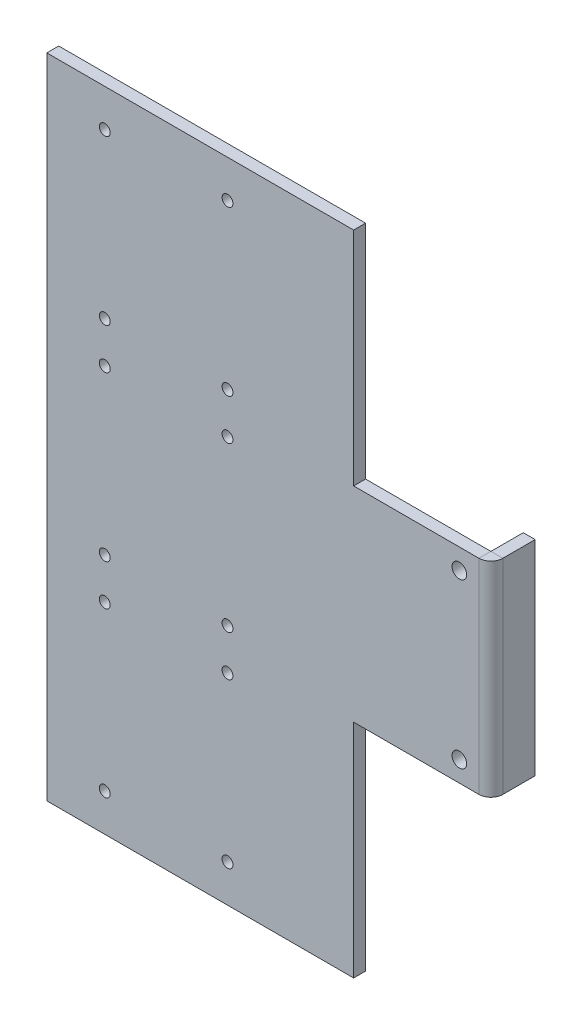
ISO-10303-21;
HEADER;
FILE_DESCRIPTION(('STEP AP214'),'2;1');
FILE_NAME('part.step','',(''),(''),'','','');
FILE_SCHEMA(('AUTOMOTIVE_DESIGN { 1 0 10303 214 1 1 1 1 }'));
ENDSEC;
DATA;
#1=APPLICATION_CONTEXT('core data for automotive mechanical design processes');
#2=APPLICATION_PROTOCOL_DEFINITION('international standard','automotive_design',2000,#1);
#3=PRODUCT_CONTEXT('',#1,'mechanical');
#4=PRODUCT('Part','Part','',(#3));
#5=PRODUCT_RELATED_PRODUCT_CATEGORY('part','',(#4));
#6=PRODUCT_DEFINITION_FORMATION('','',#4);
#7=PRODUCT_DEFINITION_CONTEXT('part definition',#1,'design');
#8=PRODUCT_DEFINITION('design','',#6,#7);
#9=PRODUCT_DEFINITION_SHAPE('','',#8);
#10=(LENGTH_UNIT() NAMED_UNIT(*) SI_UNIT(.MILLI.,.METRE.));
#11=(NAMED_UNIT(*) PLANE_ANGLE_UNIT() SI_UNIT($,.RADIAN.));
#12=(NAMED_UNIT(*) SI_UNIT($,.STERADIAN.) SOLID_ANGLE_UNIT());
#13=UNCERTAINTY_MEASURE_WITH_UNIT(LENGTH_MEASURE(1.E-05),#10,'distance_accuracy_value','');
#14=(GEOMETRIC_REPRESENTATION_CONTEXT(3) GLOBAL_UNCERTAINTY_ASSIGNED_CONTEXT((#13)) GLOBAL_UNIT_ASSIGNED_CONTEXT((#10,
#11,#12)) REPRESENTATION_CONTEXT('',''));
#15=CARTESIAN_POINT('',(0.,0.,0.));
#16=DIRECTION('',(0.,0.,1.));
#17=DIRECTION('',(1.,0.,0.));
#18=AXIS2_PLACEMENT_3D('',#15,#16,#17);
#19=CARTESIAN_POINT('',(81.7555532140548,0.,81.0044467859456));
#20=DIRECTION('',(1.,0.,0.));
#21=DIRECTION('',(0.,0.,-1.));
#22=AXIS2_PLACEMENT_3D('',#19,#20,#21);
#23=PLANE('',#22);
#24=DIRECTION('',(0.,0.,-1.));
#25=VECTOR('',#24,1.);
#26=CARTESIAN_POINT('',(81.7555532140545,-30.,-12.9955532140545));
#27=LINE('',#26,#25);
#28=CARTESIAN_POINT('',(81.7555532140545,-30.,-3.5));
#29=VERTEX_POINT('',#28);
#30=CARTESIAN_POINT('',(81.7555532140545,-30.,-12.9955532140545));
#31=VERTEX_POINT('',#30);
#32=EDGE_CURVE('E66',#29,#31,#27,.T.);
#33=ORIENTED_EDGE('',*,*,#32,.F.);
#34=DIRECTION('',(0.,1.,0.));
#35=VECTOR('',#34,1.);
#36=CARTESIAN_POINT('',(81.7555532140546,0.,-3.5));
#37=LINE('',#36,#35);
#38=CARTESIAN_POINT('',(81.7555532140545,30.,-3.5));
#39=VERTEX_POINT('',#38);
#40=EDGE_CURVE('E144',#29,#39,#37,.T.);
#41=ORIENTED_EDGE('',*,*,#40,.T.);
#42=DIRECTION('',(0.,0.,1.));
#43=VECTOR('',#42,1.);
#44=CARTESIAN_POINT('',(81.7555532140545,30.,-12.9955532140545));
#45=LINE('',#44,#43);
#46=CARTESIAN_POINT('',(81.7555532140545,30.,-12.9955532140545));
#47=VERTEX_POINT('',#46);
#48=EDGE_CURVE('E74',#47,#39,#45,.T.);
#49=ORIENTED_EDGE('',*,*,#48,.F.);
#50=DIRECTION('',(0.,1.,0.));
#51=VECTOR('',#50,1.);
#52=CARTESIAN_POINT('',(81.7555532140545,30.,-12.9955532140545));
#53=LINE('',#52,#51);
#54=EDGE_CURVE('E251',#31,#47,#53,.T.);
#55=ORIENTED_EDGE('',*,*,#54,.F.);
#56=EDGE_LOOP('',(#33,#41,#49,#55));
#57=FACE_BOUND('',#56,.T.);
#58=ADVANCED_FACE('F48',(#57),#23,.F.);
#59=CARTESIAN_POINT('',(81.7555532140545,30.,-12.9955532140545));
#60=DIRECTION('',(0.,1.,0.));
#61=DIRECTION('',(0.,0.,1.));
#62=AXIS2_PLACEMENT_3D('',#59,#60,#61);
#63=PLANE('',#62);
#64=DIRECTION('',(-1.,0.,0.));
#65=VECTOR('',#64,1.);
#66=CARTESIAN_POINT('',(81.7555532140545,30.,-3.5));
#67=LINE('',#66,#65);
#68=CARTESIAN_POINT('',(85.2555532140545,30.,-3.50000000000002));
#69=VERTEX_POINT('',#68);
#70=EDGE_CURVE('E58',#69,#39,#67,.T.);
#71=ORIENTED_EDGE('',*,*,#70,.F.);
#72=DIRECTION('',(0.,0.,1.));
#73=VECTOR('',#72,1.);
#74=CARTESIAN_POINT('',(85.2555532140545,30.,-12.9955532140545));
#75=LINE('',#74,#73);
#76=CARTESIAN_POINT('',(85.2555532140545,30.,-12.9955532140545));
#77=VERTEX_POINT('',#76);
#78=EDGE_CURVE('E258',#77,#69,#75,.T.);
#79=ORIENTED_EDGE('',*,*,#78,.F.);
#80=DIRECTION('',(1.,0.,0.));
#81=VECTOR('',#80,1.);
#82=CARTESIAN_POINT('',(81.7555532140545,30.,-12.9955532140545));
#83=LINE('',#82,#81);
#84=EDGE_CURVE('E259',#47,#77,#83,.T.);
#85=ORIENTED_EDGE('',*,*,#84,.F.);
#86=ORIENTED_EDGE('',*,*,#48,.T.);
#87=EDGE_LOOP('',(#71,#79,#85,#86));
#88=FACE_BOUND('',#87,.T.);
#89=ADVANCED_FACE('F567',(#88),#63,.T.);
#90=CARTESIAN_POINT('',(81.7555532140545,30.,-12.9955532140545));
#91=DIRECTION('',(0.,0.,-1.));
#92=DIRECTION('',(0.,1.,0.));
#93=AXIS2_PLACEMENT_3D('',#90,#91,#92);
#94=PLANE('',#93);
#95=DIRECTION('',(0.,1.,0.));
#96=VECTOR('',#95,1.);
#97=CARTESIAN_POINT('',(85.2555532140545,30.,-12.9955532140545));
#98=LINE('',#97,#96);
#99=CARTESIAN_POINT('',(85.2555532140545,-30.,-12.9955532140545));
#100=VERTEX_POINT('',#99);
#101=EDGE_CURVE('E180',#100,#77,#98,.T.);
#102=ORIENTED_EDGE('',*,*,#101,.F.);
#103=DIRECTION('',(1.,0.,0.));
#104=VECTOR('',#103,1.);
#105=CARTESIAN_POINT('',(81.7555532140545,-30.,-12.9955532140545));
#106=LINE('',#105,#104);
#107=EDGE_CURVE('E263',#31,#100,#106,.T.);
#108=ORIENTED_EDGE('',*,*,#107,.F.);
#109=ORIENTED_EDGE('',*,*,#54,.T.);
#110=ORIENTED_EDGE('',*,*,#84,.T.);
#111=EDGE_LOOP('',(#102,#108,#109,#110));
#112=FACE_BOUND('',#111,.T.);
#113=ADVANCED_FACE('F574',(#112),#94,.T.);
#114=CARTESIAN_POINT('',(81.7555532140545,-30.,-12.9955532140545));
#115=DIRECTION('',(0.,-1.,0.));
#116=DIRECTION('',(0.,0.,-1.));
#117=AXIS2_PLACEMENT_3D('',#114,#115,#116);
#118=PLANE('',#117);
#119=DIRECTION('',(1.,0.,0.));
#120=VECTOR('',#119,1.);
#121=CARTESIAN_POINT('',(81.7555532140545,-30.,-3.5));
#122=LINE('',#121,#120);
#123=CARTESIAN_POINT('',(85.2555532140546,-30.,-3.50000000000003));
#124=VERTEX_POINT('',#123);
#125=EDGE_CURVE('E12',#29,#124,#122,.T.);
#126=ORIENTED_EDGE('',*,*,#125,.F.);
#127=ORIENTED_EDGE('',*,*,#32,.T.);
#128=ORIENTED_EDGE('',*,*,#107,.T.);
#129=DIRECTION('',(0.,0.,-1.));
#130=VECTOR('',#129,1.);
#131=CARTESIAN_POINT('',(85.2555532140545,-30.,-12.9955532140545));
#132=LINE('',#131,#130);
#133=EDGE_CURVE('E174',#124,#100,#132,.T.);
#134=ORIENTED_EDGE('',*,*,#133,.F.);
#135=EDGE_LOOP('',(#126,#127,#128,#134));
#136=FACE_BOUND('',#135,.T.);
#137=ADVANCED_FACE('F50',(#136),#118,.T.);
#138=CARTESIAN_POINT('',(85.2555532140548,0.,81.0044467859456));
#139=DIRECTION('',(1.,0.,0.));
#140=DIRECTION('',(0.,0.,-1.));
#141=AXIS2_PLACEMENT_3D('',#138,#139,#140);
#142=PLANE('',#141);
#143=DIRECTION('',(0.,1.,0.));
#144=VECTOR('',#143,1.);
#145=CARTESIAN_POINT('',(85.2555532140545,0.,-3.50000000000002));
#146=LINE('',#145,#144);
#147=EDGE_CURVE('E262',#124,#69,#146,.T.);
#148=ORIENTED_EDGE('',*,*,#147,.F.);
#149=ORIENTED_EDGE('',*,*,#133,.T.);
#150=ORIENTED_EDGE('',*,*,#101,.T.);
#151=ORIENTED_EDGE('',*,*,#78,.T.);
#152=EDGE_LOOP('',(#148,#149,#150,#151));
#153=FACE_BOUND('',#152,.T.);
#154=ADVANCED_FACE('F571',(#153),#142,.T.);
#155=CARTESIAN_POINT('',(45.0000000000001,-30.,-3.5));
#156=DIRECTION('',(1.,0.,0.));
#157=DIRECTION('',(0.,1.,0.));
#158=AXIS2_PLACEMENT_3D('',#155,#156,#157);
#159=PLANE('',#158);
#160=DIRECTION('',(0.,1.,0.));
#161=VECTOR('',#160,1.);
#162=CARTESIAN_POINT('',(45.0000000000001,-30.,0.));
#163=LINE('',#162,#161);
#164=CARTESIAN_POINT('',(45.0000000000001,-95.,0.));
#165=VERTEX_POINT('',#164);
#166=CARTESIAN_POINT('',(45.0000000000001,-30.,0.));
#167=VERTEX_POINT('',#166);
#168=EDGE_CURVE('E164',#165,#167,#163,.T.);
#169=ORIENTED_EDGE('',*,*,#168,.F.);
#170=DIRECTION('',(0.,0.,1.));
#171=VECTOR('',#170,1.);
#172=CARTESIAN_POINT('',(45.0000000000001,-95.,-3.5));
#173=LINE('',#172,#171);
#174=CARTESIAN_POINT('',(45.0000000000001,-95.,-3.5));
#175=VERTEX_POINT('',#174);
#176=EDGE_CURVE('E235',#175,#165,#173,.T.);
#177=ORIENTED_EDGE('',*,*,#176,.F.);
#178=DIRECTION('',(0.,1.,0.));
#179=VECTOR('',#178,1.);
#180=CARTESIAN_POINT('',(45.0000000000001,-30.,-3.5));
#181=LINE('',#180,#179);
#182=CARTESIAN_POINT('',(45.0000000000001,-30.,-3.5));
#183=VERTEX_POINT('',#182);
#184=EDGE_CURVE('E245',#175,#183,#181,.T.);
#185=ORIENTED_EDGE('',*,*,#184,.T.);
#186=DIRECTION('',(0.,0.,1.));
#187=VECTOR('',#186,1.);
#188=CARTESIAN_POINT('',(45.0000000000001,-30.,-3.5));
#189=LINE('',#188,#187);
#190=EDGE_CURVE('E242',#183,#167,#189,.T.);
#191=ORIENTED_EDGE('',*,*,#190,.T.);
#192=EDGE_LOOP('',(#169,#177,#185,#191));
#193=FACE_BOUND('',#192,.T.);
#194=ADVANCED_FACE('F581',(#193),#159,.T.);
#195=CARTESIAN_POINT('',(-44.9999999999999,-95.,-3.5));
#196=DIRECTION('',(0.,-1.,0.));
#197=DIRECTION('',(0.,0.,-1.));
#198=AXIS2_PLACEMENT_3D('',#195,#196,#197);
#199=PLANE('',#198);
#200=DIRECTION('',(1.,0.,0.));
#201=VECTOR('',#200,1.);
#202=CARTESIAN_POINT('',(-44.9999999999999,-95.,0.));
#203=LINE('',#202,#201);
#204=CARTESIAN_POINT('',(-44.9999999999999,-95.,0.));
#205=VERTEX_POINT('',#204);
#206=EDGE_CURVE('E198',#205,#165,#203,.T.);
#207=ORIENTED_EDGE('',*,*,#206,.F.);
#208=DIRECTION('',(0.,0.,1.));
#209=VECTOR('',#208,1.);
#210=CARTESIAN_POINT('',(-44.9999999999999,-95.,-3.5));
#211=LINE('',#210,#209);
#212=CARTESIAN_POINT('',(-44.9999999999999,-95.,-3.5));
#213=VERTEX_POINT('',#212);
#214=EDGE_CURVE('E228',#213,#205,#211,.T.);
#215=ORIENTED_EDGE('',*,*,#214,.F.);
#216=DIRECTION('',(1.,0.,0.));
#217=VECTOR('',#216,1.);
#218=CARTESIAN_POINT('',(-44.9999999999999,-95.,-3.5));
#219=LINE('',#218,#217);
#220=EDGE_CURVE('E238',#213,#175,#219,.T.);
#221=ORIENTED_EDGE('',*,*,#220,.T.);
#222=ORIENTED_EDGE('',*,*,#176,.T.);
#223=EDGE_LOOP('',(#207,#215,#221,#222));
#224=FACE_BOUND('',#223,.T.);
#225=ADVANCED_FACE('F605',(#224),#199,.T.);
#226=CARTESIAN_POINT('',(-44.9999999999999,95.,-3.5));
#227=DIRECTION('',(-1.,0.,0.));
#228=DIRECTION('',(0.,-1.,0.));
#229=AXIS2_PLACEMENT_3D('',#226,#227,#228);
#230=PLANE('',#229);
#231=DIRECTION('',(0.,-1.,0.));
#232=VECTOR('',#231,1.);
#233=CARTESIAN_POINT('',(-44.9999999999999,95.,0.));
#234=LINE('',#233,#232);
#235=CARTESIAN_POINT('',(-44.9999999999999,95.,0.));
#236=VERTEX_POINT('',#235);
#237=EDGE_CURVE('E201',#236,#205,#234,.T.);
#238=ORIENTED_EDGE('',*,*,#237,.F.);
#239=DIRECTION('',(0.,0.,1.));
#240=VECTOR('',#239,1.);
#241=CARTESIAN_POINT('',(-44.9999999999999,95.,-3.5));
#242=LINE('',#241,#240);
#243=CARTESIAN_POINT('',(-44.9999999999999,95.,-3.5));
#244=VERTEX_POINT('',#243);
#245=EDGE_CURVE('E221',#244,#236,#242,.T.);
#246=ORIENTED_EDGE('',*,*,#245,.F.);
#247=DIRECTION('',(0.,-1.,0.));
#248=VECTOR('',#247,1.);
#249=CARTESIAN_POINT('',(-44.9999999999999,95.,-3.5));
#250=LINE('',#249,#248);
#251=EDGE_CURVE('E231',#244,#213,#250,.T.);
#252=ORIENTED_EDGE('',*,*,#251,.T.);
#253=ORIENTED_EDGE('',*,*,#214,.T.);
#254=EDGE_LOOP('',(#238,#246,#252,#253));
#255=FACE_BOUND('',#254,.T.);
#256=ADVANCED_FACE('F601',(#255),#230,.T.);
#257=CARTESIAN_POINT('',(-44.9999999999999,95.,-3.5));
#258=DIRECTION('',(0.,1.,0.));
#259=DIRECTION('',(0.,0.,1.));
#260=AXIS2_PLACEMENT_3D('',#257,#258,#259);
#261=PLANE('',#260);
#262=DIRECTION('',(-1.,0.,0.));
#263=VECTOR('',#262,1.);
#264=CARTESIAN_POINT('',(-44.9999999999999,95.,0.));
#265=LINE('',#264,#263);
#266=CARTESIAN_POINT('',(45.0000000000001,95.,0.));
#267=VERTEX_POINT('',#266);
#268=EDGE_CURVE('E205',#267,#236,#265,.T.);
#269=ORIENTED_EDGE('',*,*,#268,.F.);
#270=DIRECTION('',(0.,0.,1.));
#271=VECTOR('',#270,1.);
#272=CARTESIAN_POINT('',(45.0000000000001,95.,-3.5));
#273=LINE('',#272,#271);
#274=CARTESIAN_POINT('',(45.0000000000001,95.,-3.5));
#275=VERTEX_POINT('',#274);
#276=EDGE_CURVE('E167',#275,#267,#273,.T.);
#277=ORIENTED_EDGE('',*,*,#276,.F.);
#278=DIRECTION('',(-1.,0.,0.));
#279=VECTOR('',#278,1.);
#280=CARTESIAN_POINT('',(-44.9999999999999,95.,-3.5));
#281=LINE('',#280,#279);
#282=EDGE_CURVE('E224',#275,#244,#281,.T.);
#283=ORIENTED_EDGE('',*,*,#282,.T.);
#284=ORIENTED_EDGE('',*,*,#245,.T.);
#285=EDGE_LOOP('',(#269,#277,#283,#284));
#286=FACE_BOUND('',#285,.T.);
#287=ADVANCED_FACE('F597',(#286),#261,.T.);
#288=CARTESIAN_POINT('',(45.0000000000001,95.,-3.5));
#289=DIRECTION('',(1.,0.,0.));
#290=DIRECTION('',(0.,1.,0.));
#291=AXIS2_PLACEMENT_3D('',#288,#289,#290);
#292=PLANE('',#291);
#293=DIRECTION('',(0.,1.,0.));
#294=VECTOR('',#293,1.);
#295=CARTESIAN_POINT('',(45.0000000000001,95.,0.));
#296=LINE('',#295,#294);
#297=CARTESIAN_POINT('',(45.0000000000001,30.,0.));
#298=VERTEX_POINT('',#297);
#299=EDGE_CURVE('E209',#298,#267,#296,.T.);
#300=ORIENTED_EDGE('',*,*,#299,.F.);
#301=DIRECTION('',(0.,0.,1.));
#302=VECTOR('',#301,1.);
#303=CARTESIAN_POINT('',(45.0000000000001,30.,-3.5));
#304=LINE('',#303,#302);
#305=CARTESIAN_POINT('',(45.0000000000001,30.,-3.5));
#306=VERTEX_POINT('',#305);
#307=EDGE_CURVE('E182',#306,#298,#304,.T.);
#308=ORIENTED_EDGE('',*,*,#307,.F.);
#309=DIRECTION('',(0.,1.,0.));
#310=VECTOR('',#309,1.);
#311=CARTESIAN_POINT('',(45.0000000000001,95.,-3.5));
#312=LINE('',#311,#310);
#313=EDGE_CURVE('E217',#306,#275,#312,.T.);
#314=ORIENTED_EDGE('',*,*,#313,.T.);
#315=ORIENTED_EDGE('',*,*,#276,.T.);
#316=EDGE_LOOP('',(#300,#308,#314,#315));
#317=FACE_BOUND('',#316,.T.);
#318=ADVANCED_FACE('F525',(#317),#292,.T.);
#319=CARTESIAN_POINT('',(0.,0.,0.));
#320=DIRECTION('',(0.,0.,1.));
#321=DIRECTION('',(1.,0.,0.));
#322=AXIS2_PLACEMENT_3D('',#319,#320,#321);
#323=PLANE('',#322);
#324=CARTESIAN_POINT('',(-28.,-36.,0.));
#325=DIRECTION('',(0.,0.,1.));
#326=DIRECTION('',(1.,0.,0.));
#327=AXIS2_PLACEMENT_3D('',#324,#325,#326);
#328=CIRCLE('',#327,1.6);
#329=CARTESIAN_POINT('',(-26.4,-36.,0.));
#330=VERTEX_POINT('',#329);
#331=EDGE_CURVE('E507',#330,#330,#328,.T.);
#332=ORIENTED_EDGE('',*,*,#331,.F.);
#333=EDGE_LOOP('',(#332));
#334=FACE_BOUND('',#333,.T.);
#335=CARTESIAN_POINT('',(-28.,-84.,0.));
#336=DIRECTION('',(0.,0.,1.));
#337=DIRECTION('',(1.,0.,0.));
#338=AXIS2_PLACEMENT_3D('',#335,#336,#337);
#339=CIRCLE('',#338,1.6);
#340=CARTESIAN_POINT('',(-26.4,-84.,0.));
#341=VERTEX_POINT('',#340);
#342=EDGE_CURVE('E494',#341,#341,#339,.T.);
#343=ORIENTED_EDGE('',*,*,#342,.F.);
#344=EDGE_LOOP('',(#343));
#345=FACE_BOUND('',#344,.T.);
#346=CARTESIAN_POINT('',(8.00000000000001,-84.,0.));
#347=DIRECTION('',(0.,0.,1.));
#348=DIRECTION('',(1.,0.,0.));
#349=AXIS2_PLACEMENT_3D('',#346,#347,#348);
#350=CIRCLE('',#349,1.6);
#351=CARTESIAN_POINT('',(9.60000000000001,-84.,0.));
#352=VERTEX_POINT('',#351);
#353=EDGE_CURVE('E319',#352,#352,#350,.T.);
#354=ORIENTED_EDGE('',*,*,#353,.F.);
#355=EDGE_LOOP('',(#354));
#356=FACE_BOUND('',#355,.T.);
#357=CARTESIAN_POINT('',(8.00000000000001,-36.,0.));
#358=DIRECTION('',(0.,0.,1.));
#359=DIRECTION('',(1.,0.,0.));
#360=AXIS2_PLACEMENT_3D('',#357,#358,#359);
#361=CIRCLE('',#360,1.6);
#362=CARTESIAN_POINT('',(9.6,-36.,0.));
#363=VERTEX_POINT('',#362);
#364=EDGE_CURVE('E301',#363,#363,#361,.T.);
#365=ORIENTED_EDGE('',*,*,#364,.F.);
#366=EDGE_LOOP('',(#365));
#367=FACE_BOUND('',#366,.T.);
#368=CARTESIAN_POINT('',(-28.,84.,0.));
#369=DIRECTION('',(0.,0.,1.));
#370=DIRECTION('',(1.,0.,0.));
#371=AXIS2_PLACEMENT_3D('',#368,#369,#370);
#372=CIRCLE('',#371,1.6);
#373=CARTESIAN_POINT('',(-26.4,84.,0.));
#374=VERTEX_POINT('',#373);
#375=EDGE_CURVE('E297',#374,#374,#372,.T.);
#376=ORIENTED_EDGE('',*,*,#375,.F.);
#377=EDGE_LOOP('',(#376));
#378=FACE_BOUND('',#377,.T.);
#379=CARTESIAN_POINT('',(-28.,36.,0.));
#380=DIRECTION('',(0.,0.,1.));
#381=DIRECTION('',(1.,0.,0.));
#382=AXIS2_PLACEMENT_3D('',#379,#380,#381);
#383=CIRCLE('',#382,1.6);
#384=CARTESIAN_POINT('',(-26.4,36.,0.));
#385=VERTEX_POINT('',#384);
#386=EDGE_CURVE('E293',#385,#385,#383,.T.);
#387=ORIENTED_EDGE('',*,*,#386,.F.);
#388=EDGE_LOOP('',(#387));
#389=FACE_BOUND('',#388,.T.);
#390=CARTESIAN_POINT('',(7.99999999999999,36.,0.));
#391=DIRECTION('',(0.,0.,1.));
#392=DIRECTION('',(1.,0.,0.));
#393=AXIS2_PLACEMENT_3D('',#390,#391,#392);
#394=CIRCLE('',#393,1.6);
#395=CARTESIAN_POINT('',(9.59999999999999,36.,0.));
#396=VERTEX_POINT('',#395);
#397=EDGE_CURVE('E292',#396,#396,#394,.T.);
#398=ORIENTED_EDGE('',*,*,#397,.F.);
#399=EDGE_LOOP('',(#398));
#400=FACE_BOUND('',#399,.T.);
#401=CARTESIAN_POINT('',(7.99999999999999,84.,0.));
#402=DIRECTION('',(0.,0.,1.));
#403=DIRECTION('',(1.,0.,0.));
#404=AXIS2_PLACEMENT_3D('',#401,#402,#403);
#405=CIRCLE('',#404,1.6);
#406=CARTESIAN_POINT('',(9.59999999999999,84.,0.));
#407=VERTEX_POINT('',#406);
#408=EDGE_CURVE('E333',#407,#407,#405,.T.);
#409=ORIENTED_EDGE('',*,*,#408,.F.);
#410=EDGE_LOOP('',(#409));
#411=FACE_BOUND('',#410,.T.);
#412=CARTESIAN_POINT('',(-28.,24.,0.));
#413=DIRECTION('',(0.,0.,1.));
#414=DIRECTION('',(1.,0.,0.));
#415=AXIS2_PLACEMENT_3D('',#412,#413,#414);
#416=CIRCLE('',#415,1.6);
#417=CARTESIAN_POINT('',(-26.4,24.,0.));
#418=VERTEX_POINT('',#417);
#419=EDGE_CURVE('E341',#418,#418,#416,.T.);
#420=ORIENTED_EDGE('',*,*,#419,.F.);
#421=EDGE_LOOP('',(#420));
#422=FACE_BOUND('',#421,.T.);
#423=CARTESIAN_POINT('',(-28.,-24.,0.));
#424=DIRECTION('',(0.,0.,1.));
#425=DIRECTION('',(1.,0.,0.));
#426=AXIS2_PLACEMENT_3D('',#423,#424,#425);
#427=CIRCLE('',#426,1.6);
#428=CARTESIAN_POINT('',(-26.4,-24.,0.));
#429=VERTEX_POINT('',#428);
#430=EDGE_CURVE('E349',#429,#429,#427,.T.);
#431=ORIENTED_EDGE('',*,*,#430,.F.);
#432=EDGE_LOOP('',(#431));
#433=FACE_BOUND('',#432,.T.);
#434=CARTESIAN_POINT('',(8.,-24.,0.));
#435=DIRECTION('',(0.,0.,1.));
#436=DIRECTION('',(1.,0.,0.));
#437=AXIS2_PLACEMENT_3D('',#434,#435,#436);
#438=CIRCLE('',#437,1.6);
#439=CARTESIAN_POINT('',(9.6,-24.,0.));
#440=VERTEX_POINT('',#439);
#441=EDGE_CURVE('E357',#440,#440,#438,.T.);
#442=ORIENTED_EDGE('',*,*,#441,.F.);
#443=EDGE_LOOP('',(#442));
#444=FACE_BOUND('',#443,.T.);
#445=CARTESIAN_POINT('',(8.,24.,0.));
#446=DIRECTION('',(0.,0.,1.));
#447=DIRECTION('',(1.,0.,0.));
#448=AXIS2_PLACEMENT_3D('',#445,#446,#447);
#449=CIRCLE('',#448,1.6);
#450=CARTESIAN_POINT('',(9.59999999999999,24.,0.));
#451=VERTEX_POINT('',#450);
#452=EDGE_CURVE('E365',#451,#451,#449,.T.);
#453=ORIENTED_EDGE('',*,*,#452,.F.);
#454=EDGE_LOOP('',(#453));
#455=FACE_BOUND('',#454,.T.);
#456=CARTESIAN_POINT('',(76.0000000000001,24.,0.));
#457=DIRECTION('',(0.,0.,1.));
#458=DIRECTION('',(1.,0.,0.));
#459=AXIS2_PLACEMENT_3D('',#456,#457,#458);
#460=CIRCLE('',#459,2.14999999999999);
#461=CARTESIAN_POINT('',(78.1500000000001,24.,0.));
#462=VERTEX_POINT('',#461);
#463=EDGE_CURVE('E287',#462,#462,#460,.T.);
#464=ORIENTED_EDGE('',*,*,#463,.F.);
#465=EDGE_LOOP('',(#464));
#466=FACE_BOUND('',#465,.T.);
#467=CARTESIAN_POINT('',(76.0000000000001,-24.,0.));
#468=DIRECTION('',(0.,0.,1.));
#469=DIRECTION('',(1.,0.,0.));
#470=AXIS2_PLACEMENT_3D('',#467,#468,#469);
#471=CIRCLE('',#470,2.14999999999999);
#472=CARTESIAN_POINT('',(78.1500000000001,-24.,0.));
#473=VERTEX_POINT('',#472);
#474=EDGE_CURVE('E282',#473,#473,#471,.T.);
#475=ORIENTED_EDGE('',*,*,#474,.F.);
#476=EDGE_LOOP('',(#475));
#477=FACE_BOUND('',#476,.T.);
#478=DIRECTION('',(1.,0.,0.));
#479=VECTOR('',#478,1.);
#480=CARTESIAN_POINT('',(94.0000000000001,-30.,0.));
#481=LINE('',#480,#479);
#482=CARTESIAN_POINT('',(81.7555532140546,-30.,0.));
#483=VERTEX_POINT('',#482);
#484=EDGE_CURVE('E157',#167,#483,#481,.T.);
#485=ORIENTED_EDGE('',*,*,#484,.T.);
#486=DIRECTION('',(0.,1.,0.));
#487=VECTOR('',#486,1.);
#488=CARTESIAN_POINT('',(81.7555532140546,0.,0.));
#489=LINE('',#488,#487);
#490=CARTESIAN_POINT('',(81.7555532140546,30.,0.));
#491=VERTEX_POINT('',#490);
#492=EDGE_CURVE('E148',#483,#491,#489,.T.);
#493=ORIENTED_EDGE('',*,*,#492,.T.);
#494=DIRECTION('',(-1.,0.,0.));
#495=VECTOR('',#494,1.);
#496=CARTESIAN_POINT('',(94.0000000000001,30.,0.));
#497=LINE('',#496,#495);
#498=EDGE_CURVE('E156',#491,#298,#497,.T.);
#499=ORIENTED_EDGE('',*,*,#498,.T.);
#500=ORIENTED_EDGE('',*,*,#299,.T.);
#501=ORIENTED_EDGE('',*,*,#268,.T.);
#502=ORIENTED_EDGE('',*,*,#237,.T.);
#503=ORIENTED_EDGE('',*,*,#206,.T.);
#504=ORIENTED_EDGE('',*,*,#168,.T.);
#505=EDGE_LOOP('',(#485,#493,#499,#500,#501,#502,#503,#504));
#506=FACE_BOUND('',#505,.T.);
#507=ADVANCED_FACE('F161',(#334,#345,#356,#367,#378,#389,#400,#411,#422,#433,#444,#455,#466,
#477,#506),#323,.T.);
#508=CARTESIAN_POINT('',(94.0000000000001,30.,-3.5));
#509=DIRECTION('',(0.,1.,0.));
#510=DIRECTION('',(-1.,0.,0.));
#511=AXIS2_PLACEMENT_3D('',#508,#509,#510);
#512=PLANE('',#511);
#513=ORIENTED_EDGE('',*,*,#498,.F.);
#514=DIRECTION('',(0.,0.,-1.));
#515=VECTOR('',#514,1.);
#516=CARTESIAN_POINT('',(81.7555532140546,30.,-3.5));
#517=LINE('',#516,#515);
#518=EDGE_CURVE('E192',#491,#39,#517,.T.);
#519=ORIENTED_EDGE('',*,*,#518,.T.);
#520=DIRECTION('',(-1.,0.,0.));
#521=VECTOR('',#520,1.);
#522=CARTESIAN_POINT('',(94.0000000000001,30.,-3.5));
#523=LINE('',#522,#521);
#524=EDGE_CURVE('E189',#39,#306,#523,.T.);
#525=ORIENTED_EDGE('',*,*,#524,.T.);
#526=ORIENTED_EDGE('',*,*,#307,.T.);
#527=EDGE_LOOP('',(#513,#519,#525,#526));
#528=FACE_BOUND('',#527,.T.);
#529=ADVANCED_FACE('F524',(#528),#512,.T.);
#530=CARTESIAN_POINT('',(0.,0.,-3.5));
#531=DIRECTION('',(0.,0.,1.));
#532=DIRECTION('',(1.,0.,0.));
#533=AXIS2_PLACEMENT_3D('',#530,#531,#532);
#534=PLANE('',#533);
#535=CARTESIAN_POINT('',(-28.,-36.,-3.5));
#536=DIRECTION('',(0.,0.,1.));
#537=DIRECTION('',(1.,0.,0.));
#538=AXIS2_PLACEMENT_3D('',#535,#536,#537);
#539=CIRCLE('',#538,1.6);
#540=CARTESIAN_POINT('',(-26.4,-36.,-3.5));
#541=VERTEX_POINT('',#540);
#542=EDGE_CURVE('E52',#541,#541,#539,.T.);
#543=ORIENTED_EDGE('',*,*,#542,.T.);
#544=EDGE_LOOP('',(#543));
#545=FACE_BOUND('',#544,.T.);
#546=CARTESIAN_POINT('',(-28.,-84.,-3.5));
#547=DIRECTION('',(0.,0.,1.));
#548=DIRECTION('',(1.,0.,0.));
#549=AXIS2_PLACEMENT_3D('',#546,#547,#548);
#550=CIRCLE('',#549,1.6);
#551=CARTESIAN_POINT('',(-26.4,-84.,-3.5));
#552=VERTEX_POINT('',#551);
#553=EDGE_CURVE('E497',#552,#552,#550,.T.);
#554=ORIENTED_EDGE('',*,*,#553,.T.);
#555=EDGE_LOOP('',(#554));
#556=FACE_BOUND('',#555,.T.);
#557=CARTESIAN_POINT('',(8.00000000000001,-84.,-3.5));
#558=DIRECTION('',(0.,0.,1.));
#559=DIRECTION('',(1.,0.,0.));
#560=AXIS2_PLACEMENT_3D('',#557,#558,#559);
#561=CIRCLE('',#560,1.6);
#562=CARTESIAN_POINT('',(9.60000000000001,-84.,-3.5));
#563=VERTEX_POINT('',#562);
#564=EDGE_CURVE('E311',#563,#563,#561,.T.);
#565=ORIENTED_EDGE('',*,*,#564,.T.);
#566=EDGE_LOOP('',(#565));
#567=FACE_BOUND('',#566,.T.);
#568=CARTESIAN_POINT('',(8.00000000000001,-36.,-3.5));
#569=DIRECTION('',(0.,0.,1.));
#570=DIRECTION('',(1.,0.,0.));
#571=AXIS2_PLACEMENT_3D('',#568,#569,#570);
#572=CIRCLE('',#571,1.6);
#573=CARTESIAN_POINT('',(9.6,-36.,-3.5));
#574=VERTEX_POINT('',#573);
#575=EDGE_CURVE('E298',#574,#574,#572,.T.);
#576=ORIENTED_EDGE('',*,*,#575,.T.);
#577=EDGE_LOOP('',(#576));
#578=FACE_BOUND('',#577,.T.);
#579=CARTESIAN_POINT('',(-28.,84.,-3.5));
#580=DIRECTION('',(0.,0.,1.));
#581=DIRECTION('',(1.,0.,0.));
#582=AXIS2_PLACEMENT_3D('',#579,#580,#581);
#583=CIRCLE('',#582,1.6);
#584=CARTESIAN_POINT('',(-26.4,84.,-3.5));
#585=VERTEX_POINT('',#584);
#586=EDGE_CURVE('E294',#585,#585,#583,.T.);
#587=ORIENTED_EDGE('',*,*,#586,.T.);
#588=EDGE_LOOP('',(#587));
#589=FACE_BOUND('',#588,.T.);
#590=CARTESIAN_POINT('',(-28.,36.,-3.5));
#591=DIRECTION('',(0.,0.,1.));
#592=DIRECTION('',(1.,0.,0.));
#593=AXIS2_PLACEMENT_3D('',#590,#591,#592);
#594=CIRCLE('',#593,1.6);
#595=CARTESIAN_POINT('',(-26.4,36.,-3.5));
#596=VERTEX_POINT('',#595);
#597=EDGE_CURVE('E288',#596,#596,#594,.T.);
#598=ORIENTED_EDGE('',*,*,#597,.T.);
#599=EDGE_LOOP('',(#598));
#600=FACE_BOUND('',#599,.T.);
#601=CARTESIAN_POINT('',(7.99999999999999,36.,-3.5));
#602=DIRECTION('',(0.,0.,1.));
#603=DIRECTION('',(1.,0.,0.));
#604=AXIS2_PLACEMENT_3D('',#601,#602,#603);
#605=CIRCLE('',#604,1.6);
#606=CARTESIAN_POINT('',(9.59999999999999,36.,-3.5));
#607=VERTEX_POINT('',#606);
#608=EDGE_CURVE('E329',#607,#607,#605,.T.);
#609=ORIENTED_EDGE('',*,*,#608,.T.);
#610=EDGE_LOOP('',(#609));
#611=FACE_BOUND('',#610,.T.);
#612=CARTESIAN_POINT('',(7.99999999999999,84.,-3.5));
#613=DIRECTION('',(0.,0.,1.));
#614=DIRECTION('',(1.,0.,0.));
#615=AXIS2_PLACEMENT_3D('',#612,#613,#614);
#616=CIRCLE('',#615,1.6);
#617=CARTESIAN_POINT('',(9.59999999999998,84.,-3.5));
#618=VERTEX_POINT('',#617);
#619=EDGE_CURVE('E337',#618,#618,#616,.T.);
#620=ORIENTED_EDGE('',*,*,#619,.T.);
#621=EDGE_LOOP('',(#620));
#622=FACE_BOUND('',#621,.T.);
#623=CARTESIAN_POINT('',(-28.,24.,-3.5));
#624=DIRECTION('',(0.,0.,1.));
#625=DIRECTION('',(1.,0.,0.));
#626=AXIS2_PLACEMENT_3D('',#623,#624,#625);
#627=CIRCLE('',#626,1.6);
#628=CARTESIAN_POINT('',(-26.4,24.,-3.5));
#629=VERTEX_POINT('',#628);
#630=EDGE_CURVE('E345',#629,#629,#627,.T.);
#631=ORIENTED_EDGE('',*,*,#630,.T.);
#632=EDGE_LOOP('',(#631));
#633=FACE_BOUND('',#632,.T.);
#634=CARTESIAN_POINT('',(-28.,-24.,-3.5));
#635=DIRECTION('',(0.,0.,1.));
#636=DIRECTION('',(1.,0.,0.));
#637=AXIS2_PLACEMENT_3D('',#634,#635,#636);
#638=CIRCLE('',#637,1.6);
#639=CARTESIAN_POINT('',(-26.4,-24.,-3.5));
#640=VERTEX_POINT('',#639);
#641=EDGE_CURVE('E353',#640,#640,#638,.T.);
#642=ORIENTED_EDGE('',*,*,#641,.T.);
#643=EDGE_LOOP('',(#642));
#644=FACE_BOUND('',#643,.T.);
#645=CARTESIAN_POINT('',(8.,-24.,-3.5));
#646=DIRECTION('',(0.,0.,1.));
#647=DIRECTION('',(1.,0.,0.));
#648=AXIS2_PLACEMENT_3D('',#645,#646,#647);
#649=CIRCLE('',#648,1.6);
#650=CARTESIAN_POINT('',(9.6,-24.,-3.5));
#651=VERTEX_POINT('',#650);
#652=EDGE_CURVE('E361',#651,#651,#649,.T.);
#653=ORIENTED_EDGE('',*,*,#652,.T.);
#654=EDGE_LOOP('',(#653));
#655=FACE_BOUND('',#654,.T.);
#656=CARTESIAN_POINT('',(8.,24.,-3.5));
#657=DIRECTION('',(0.,0.,1.));
#658=DIRECTION('',(1.,0.,0.));
#659=AXIS2_PLACEMENT_3D('',#656,#657,#658);
#660=CIRCLE('',#659,1.6);
#661=CARTESIAN_POINT('',(9.59999999999999,24.,-3.5));
#662=VERTEX_POINT('',#661);
#663=EDGE_CURVE('E369',#662,#662,#660,.T.);
#664=ORIENTED_EDGE('',*,*,#663,.T.);
#665=EDGE_LOOP('',(#664));
#666=FACE_BOUND('',#665,.T.);
#667=CARTESIAN_POINT('',(76.0000000000001,24.,-3.5));
#668=DIRECTION('',(0.,0.,1.));
#669=DIRECTION('',(1.,0.,0.));
#670=AXIS2_PLACEMENT_3D('',#667,#668,#669);
#671=CIRCLE('',#670,2.14999999999999);
#672=CARTESIAN_POINT('',(78.1500000000001,24.,-3.5));
#673=VERTEX_POINT('',#672);
#674=EDGE_CURVE('E283',#673,#673,#671,.T.);
#675=ORIENTED_EDGE('',*,*,#674,.T.);
#676=EDGE_LOOP('',(#675));
#677=FACE_BOUND('',#676,.T.);
#678=CARTESIAN_POINT('',(76.0000000000001,-24.,-3.5));
#679=DIRECTION('',(0.,0.,1.));
#680=DIRECTION('',(1.,0.,0.));
#681=AXIS2_PLACEMENT_3D('',#678,#679,#680);
#682=CIRCLE('',#681,2.14999999999999);
#683=CARTESIAN_POINT('',(78.1500000000001,-24.,-3.5));
#684=VERTEX_POINT('',#683);
#685=EDGE_CURVE('E278',#684,#684,#682,.T.);
#686=ORIENTED_EDGE('',*,*,#685,.T.);
#687=EDGE_LOOP('',(#686));
#688=FACE_BOUND('',#687,.T.);
#689=ORIENTED_EDGE('',*,*,#40,.F.);
#690=DIRECTION('',(1.,0.,0.));
#691=VECTOR('',#690,1.);
#692=CARTESIAN_POINT('',(94.0000000000001,-30.,-3.5));
#693=LINE('',#692,#691);
#694=EDGE_CURVE('E171',#183,#29,#693,.T.);
#695=ORIENTED_EDGE('',*,*,#694,.F.);
#696=ORIENTED_EDGE('',*,*,#184,.F.);
#697=ORIENTED_EDGE('',*,*,#220,.F.);
#698=ORIENTED_EDGE('',*,*,#251,.F.);
#699=ORIENTED_EDGE('',*,*,#282,.F.);
#700=ORIENTED_EDGE('',*,*,#313,.F.);
#701=ORIENTED_EDGE('',*,*,#524,.F.);
#702=EDGE_LOOP('',(#689,#695,#696,#697,#698,#699,#700,#701));
#703=FACE_BOUND('',#702,.T.);
#704=ADVANCED_FACE('F557',(#545,#556,#567,#578,#589,#600,#611,#622,#633,#644,#655,#666,#677,
#688,#703),#534,.F.);
#705=CARTESIAN_POINT('',(94.0000000000001,-30.,-3.5));
#706=DIRECTION('',(0.,-1.,0.));
#707=DIRECTION('',(1.,0.,0.));
#708=AXIS2_PLACEMENT_3D('',#705,#706,#707);
#709=PLANE('',#708);
#710=ORIENTED_EDGE('',*,*,#694,.T.);
#711=DIRECTION('',(0.,0.,1.));
#712=VECTOR('',#711,1.);
#713=CARTESIAN_POINT('',(81.7555532140546,-30.,-3.5));
#714=LINE('',#713,#712);
#715=EDGE_CURVE('E139',#29,#483,#714,.T.);
#716=ORIENTED_EDGE('',*,*,#715,.T.);
#717=ORIENTED_EDGE('',*,*,#484,.F.);
#718=ORIENTED_EDGE('',*,*,#190,.F.);
#719=EDGE_LOOP('',(#710,#716,#717,#718));
#720=FACE_BOUND('',#719,.T.);
#721=ADVANCED_FACE('F169',(#720),#709,.T.);
#722=CARTESIAN_POINT('',(81.7555532140546,-30.,-3.5));
#723=DIRECTION('',(0.,-1.,0.));
#724=DIRECTION('',(0.,0.,-1.));
#725=AXIS2_PLACEMENT_3D('',#722,#723,#724);
#726=CYLINDRICAL_SURFACE('',#725,3.5);
#727=CARTESIAN_POINT('',(81.7555532140546,-30.,-3.5));
#728=DIRECTION('',(0.,-1.,0.));
#729=DIRECTION('',(0.,0.,-1.));
#730=AXIS2_PLACEMENT_3D('',#727,#728,#729);
#731=CIRCLE('',#730,3.5);
#732=EDGE_CURVE('E135',#124,#483,#731,.T.);
#733=ORIENTED_EDGE('',*,*,#732,.F.);
#734=ORIENTED_EDGE('',*,*,#147,.T.);
#735=CARTESIAN_POINT('',(81.7555532140546,30.,-3.5));
#736=DIRECTION('',(0.,-1.,0.));
#737=DIRECTION('',(0.,0.,-1.));
#738=AXIS2_PLACEMENT_3D('',#735,#736,#737);
#739=CIRCLE('',#738,3.5);
#740=EDGE_CURVE('E145',#69,#491,#739,.T.);
#741=ORIENTED_EDGE('',*,*,#740,.T.);
#742=ORIENTED_EDGE('',*,*,#492,.F.);
#743=EDGE_LOOP('',(#733,#734,#741,#742));
#744=FACE_BOUND('',#743,.T.);
#745=ADVANCED_FACE('F150',(#744),#726,.T.);
#746=CARTESIAN_POINT('',(81.7555532140546,-30.,-3.49999999999999));
#747=DIRECTION('',(0.,-1.,0.));
#748=DIRECTION('',(0.,0.,-1.));
#749=AXIS2_PLACEMENT_3D('',#746,#747,#748);
#750=PLANE('',#749);
#751=ORIENTED_EDGE('',*,*,#715,.F.);
#752=ORIENTED_EDGE('',*,*,#125,.T.);
#753=ORIENTED_EDGE('',*,*,#732,.T.);
#754=EDGE_LOOP('',(#751,#752,#753));
#755=FACE_BOUND('',#754,.T.);
#756=ADVANCED_FACE('F137',(#755),#750,.T.);
#757=CARTESIAN_POINT('',(81.7555532140546,30.,-3.49999999999999));
#758=DIRECTION('',(0.,1.,0.));
#759=DIRECTION('',(0.,0.,1.));
#760=AXIS2_PLACEMENT_3D('',#757,#758,#759);
#761=PLANE('',#760);
#762=ORIENTED_EDGE('',*,*,#70,.T.);
#763=ORIENTED_EDGE('',*,*,#518,.F.);
#764=ORIENTED_EDGE('',*,*,#740,.F.);
#765=EDGE_LOOP('',(#762,#763,#764));
#766=FACE_BOUND('',#765,.T.);
#767=ADVANCED_FACE('F553',(#766),#761,.T.);
#768=CARTESIAN_POINT('',(76.0000000000001,-24.,0.));
#769=DIRECTION('',(0.,0.,1.));
#770=DIRECTION('',(1.,0.,0.));
#771=AXIS2_PLACEMENT_3D('',#768,#769,#770);
#772=CYLINDRICAL_SURFACE('',#771,2.14999999999999);
#773=ORIENTED_EDGE('',*,*,#474,.T.);
#774=EDGE_LOOP('',(#773));
#775=FACE_BOUND('',#774,.T.);
#776=ORIENTED_EDGE('',*,*,#685,.F.);
#777=EDGE_LOOP('',(#776));
#778=FACE_BOUND('',#777,.T.);
#779=ADVANCED_FACE('F549',(#775,#778),#772,.F.);
#780=CARTESIAN_POINT('',(76.0000000000001,24.,0.));
#781=DIRECTION('',(0.,0.,1.));
#782=DIRECTION('',(1.,0.,0.));
#783=AXIS2_PLACEMENT_3D('',#780,#781,#782);
#784=CYLINDRICAL_SURFACE('',#783,2.14999999999999);
#785=ORIENTED_EDGE('',*,*,#463,.T.);
#786=EDGE_LOOP('',(#785));
#787=FACE_BOUND('',#786,.T.);
#788=ORIENTED_EDGE('',*,*,#674,.F.);
#789=EDGE_LOOP('',(#788));
#790=FACE_BOUND('',#789,.T.);
#791=ADVANCED_FACE('F552',(#787,#790),#784,.F.);
#792=CARTESIAN_POINT('',(8.,24.,0.));
#793=DIRECTION('',(0.,0.,1.));
#794=DIRECTION('',(1.,0.,0.));
#795=AXIS2_PLACEMENT_3D('',#792,#793,#794);
#796=CYLINDRICAL_SURFACE('',#795,1.6);
#797=ORIENTED_EDGE('',*,*,#452,.T.);
#798=EDGE_LOOP('',(#797));
#799=FACE_BOUND('',#798,.T.);
#800=ORIENTED_EDGE('',*,*,#663,.F.);
#801=EDGE_LOOP('',(#800));
#802=FACE_BOUND('',#801,.T.);
#803=ADVANCED_FACE('F621',(#799,#802),#796,.F.);
#804=CARTESIAN_POINT('',(8.,-24.,0.));
#805=DIRECTION('',(0.,0.,1.));
#806=DIRECTION('',(1.,0.,0.));
#807=AXIS2_PLACEMENT_3D('',#804,#805,#806);
#808=CYLINDRICAL_SURFACE('',#807,1.6);
#809=ORIENTED_EDGE('',*,*,#441,.T.);
#810=EDGE_LOOP('',(#809));
#811=FACE_BOUND('',#810,.T.);
#812=ORIENTED_EDGE('',*,*,#652,.F.);
#813=EDGE_LOOP('',(#812));
#814=FACE_BOUND('',#813,.T.);
#815=ADVANCED_FACE('F625',(#811,#814),#808,.F.);
#816=CARTESIAN_POINT('',(-28.,-24.,0.));
#817=DIRECTION('',(0.,0.,1.));
#818=DIRECTION('',(1.,0.,0.));
#819=AXIS2_PLACEMENT_3D('',#816,#817,#818);
#820=CYLINDRICAL_SURFACE('',#819,1.6);
#821=ORIENTED_EDGE('',*,*,#430,.T.);
#822=EDGE_LOOP('',(#821));
#823=FACE_BOUND('',#822,.T.);
#824=ORIENTED_EDGE('',*,*,#641,.F.);
#825=EDGE_LOOP('',(#824));
#826=FACE_BOUND('',#825,.T.);
#827=ADVANCED_FACE('F629',(#823,#826),#820,.F.);
#828=CARTESIAN_POINT('',(-28.,24.,0.));
#829=DIRECTION('',(0.,0.,1.));
#830=DIRECTION('',(1.,0.,0.));
#831=AXIS2_PLACEMENT_3D('',#828,#829,#830);
#832=CYLINDRICAL_SURFACE('',#831,1.6);
#833=ORIENTED_EDGE('',*,*,#419,.T.);
#834=EDGE_LOOP('',(#833));
#835=FACE_BOUND('',#834,.T.);
#836=ORIENTED_EDGE('',*,*,#630,.F.);
#837=EDGE_LOOP('',(#836));
#838=FACE_BOUND('',#837,.T.);
#839=ADVANCED_FACE('F633',(#835,#838),#832,.F.);
#840=CARTESIAN_POINT('',(7.99999999999999,84.,0.));
#841=DIRECTION('',(0.,0.,1.));
#842=DIRECTION('',(1.,0.,0.));
#843=AXIS2_PLACEMENT_3D('',#840,#841,#842);
#844=CYLINDRICAL_SURFACE('',#843,1.6);
#845=ORIENTED_EDGE('',*,*,#408,.T.);
#846=EDGE_LOOP('',(#845));
#847=FACE_BOUND('',#846,.T.);
#848=ORIENTED_EDGE('',*,*,#619,.F.);
#849=EDGE_LOOP('',(#848));
#850=FACE_BOUND('',#849,.T.);
#851=ADVANCED_FACE('F637',(#847,#850),#844,.F.);
#852=CARTESIAN_POINT('',(7.99999999999999,36.,0.));
#853=DIRECTION('',(0.,0.,1.));
#854=DIRECTION('',(1.,0.,0.));
#855=AXIS2_PLACEMENT_3D('',#852,#853,#854);
#856=CYLINDRICAL_SURFACE('',#855,1.6);
#857=ORIENTED_EDGE('',*,*,#397,.T.);
#858=EDGE_LOOP('',(#857));
#859=FACE_BOUND('',#858,.T.);
#860=ORIENTED_EDGE('',*,*,#608,.F.);
#861=EDGE_LOOP('',(#860));
#862=FACE_BOUND('',#861,.T.);
#863=ADVANCED_FACE('F641',(#859,#862),#856,.F.);
#864=CARTESIAN_POINT('',(-28.,36.,0.));
#865=DIRECTION('',(0.,0.,1.));
#866=DIRECTION('',(1.,0.,0.));
#867=AXIS2_PLACEMENT_3D('',#864,#865,#866);
#868=CYLINDRICAL_SURFACE('',#867,1.6);
#869=ORIENTED_EDGE('',*,*,#386,.T.);
#870=EDGE_LOOP('',(#869));
#871=FACE_BOUND('',#870,.T.);
#872=ORIENTED_EDGE('',*,*,#597,.F.);
#873=EDGE_LOOP('',(#872));
#874=FACE_BOUND('',#873,.T.);
#875=ADVANCED_FACE('F645',(#871,#874),#868,.F.);
#876=CARTESIAN_POINT('',(-28.,84.,0.));
#877=DIRECTION('',(0.,0.,1.));
#878=DIRECTION('',(1.,0.,0.));
#879=AXIS2_PLACEMENT_3D('',#876,#877,#878);
#880=CYLINDRICAL_SURFACE('',#879,1.6);
#881=ORIENTED_EDGE('',*,*,#375,.T.);
#882=EDGE_LOOP('',(#881));
#883=FACE_BOUND('',#882,.T.);
#884=ORIENTED_EDGE('',*,*,#586,.F.);
#885=EDGE_LOOP('',(#884));
#886=FACE_BOUND('',#885,.T.);
#887=ADVANCED_FACE('F649',(#883,#886),#880,.F.);
#888=CARTESIAN_POINT('',(8.00000000000001,-36.,0.));
#889=DIRECTION('',(0.,0.,1.));
#890=DIRECTION('',(1.,0.,0.));
#891=AXIS2_PLACEMENT_3D('',#888,#889,#890);
#892=CYLINDRICAL_SURFACE('',#891,1.6);
#893=ORIENTED_EDGE('',*,*,#364,.T.);
#894=EDGE_LOOP('',(#893));
#895=FACE_BOUND('',#894,.T.);
#896=ORIENTED_EDGE('',*,*,#575,.F.);
#897=EDGE_LOOP('',(#896));
#898=FACE_BOUND('',#897,.T.);
#899=ADVANCED_FACE('F653',(#895,#898),#892,.F.);
#900=CARTESIAN_POINT('',(8.00000000000001,-84.,0.));
#901=DIRECTION('',(0.,0.,1.));
#902=DIRECTION('',(1.,0.,0.));
#903=AXIS2_PLACEMENT_3D('',#900,#901,#902);
#904=CYLINDRICAL_SURFACE('',#903,1.6);
#905=ORIENTED_EDGE('',*,*,#353,.T.);
#906=EDGE_LOOP('',(#905));
#907=FACE_BOUND('',#906,.T.);
#908=ORIENTED_EDGE('',*,*,#564,.F.);
#909=EDGE_LOOP('',(#908));
#910=FACE_BOUND('',#909,.T.);
#911=ADVANCED_FACE('F519',(#907,#910),#904,.F.);
#912=CARTESIAN_POINT('',(-28.,-84.,0.));
#913=DIRECTION('',(0.,0.,1.));
#914=DIRECTION('',(1.,0.,0.));
#915=AXIS2_PLACEMENT_3D('',#912,#913,#914);
#916=CYLINDRICAL_SURFACE('',#915,1.6);
#917=ORIENTED_EDGE('',*,*,#342,.T.);
#918=EDGE_LOOP('',(#917));
#919=FACE_BOUND('',#918,.T.);
#920=ORIENTED_EDGE('',*,*,#553,.F.);
#921=EDGE_LOOP('',(#920));
#922=FACE_BOUND('',#921,.T.);
#923=ADVANCED_FACE('F659',(#919,#922),#916,.F.);
#924=CARTESIAN_POINT('',(-28.,-36.,0.));
#925=DIRECTION('',(0.,0.,1.));
#926=DIRECTION('',(1.,0.,0.));
#927=AXIS2_PLACEMENT_3D('',#924,#925,#926);
#928=CYLINDRICAL_SURFACE('',#927,1.6);
#929=ORIENTED_EDGE('',*,*,#331,.T.);
#930=EDGE_LOOP('',(#929));
#931=FACE_BOUND('',#930,.T.);
#932=ORIENTED_EDGE('',*,*,#542,.F.);
#933=EDGE_LOOP('',(#932));
#934=FACE_BOUND('',#933,.T.);
#935=ADVANCED_FACE('F662',(#931,#934),#928,.F.);
#936=CLOSED_SHELL('',(#58,#89,#113,#137,#154,#194,#225,#256,#287,#318,#507,#529,#704,#721,#745,
#756,#767,#779,#791,#803,#815,#827,#839,#851,#863,#875,#887,#899,#911,#923,#935));
#937=MANIFOLD_SOLID_BREP('B2',#936);
#938=ADVANCED_BREP_SHAPE_REPRESENTATION('',(#18,#937),#14);
#939=SHAPE_DEFINITION_REPRESENTATION(#9,#938);
ENDSEC;
END-ISO-10303-21;
